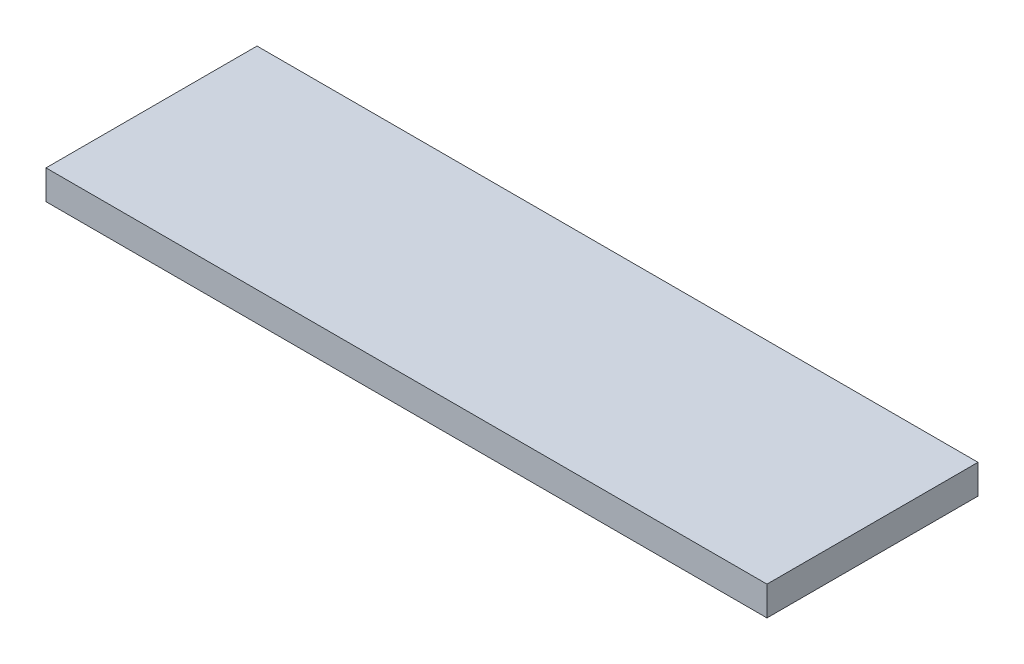
ISO-10303-21;
HEADER;
FILE_DESCRIPTION(('STEP AP214'),'2;1');
FILE_NAME('part.step','',(''),(''),'','','');
FILE_SCHEMA(('AUTOMOTIVE_DESIGN { 1 0 10303 214 1 1 1 1 }'));
ENDSEC;
DATA;
#1=APPLICATION_CONTEXT('core data for automotive mechanical design processes');
#2=APPLICATION_PROTOCOL_DEFINITION('international standard','automotive_design',2000,#1);
#3=PRODUCT_CONTEXT('',#1,'mechanical');
#4=PRODUCT('Part','Part','',(#3));
#5=PRODUCT_RELATED_PRODUCT_CATEGORY('part','',(#4));
#6=PRODUCT_DEFINITION_FORMATION('','',#4);
#7=PRODUCT_DEFINITION_CONTEXT('part definition',#1,'design');
#8=PRODUCT_DEFINITION('design','',#6,#7);
#9=PRODUCT_DEFINITION_SHAPE('','',#8);
#10=(LENGTH_UNIT() NAMED_UNIT(*) SI_UNIT(.MILLI.,.METRE.));
#11=(NAMED_UNIT(*) PLANE_ANGLE_UNIT() SI_UNIT($,.RADIAN.));
#12=(NAMED_UNIT(*) SI_UNIT($,.STERADIAN.) SOLID_ANGLE_UNIT());
#13=UNCERTAINTY_MEASURE_WITH_UNIT(LENGTH_MEASURE(1.E-05),#10,'distance_accuracy_value','');
#14=(GEOMETRIC_REPRESENTATION_CONTEXT(3) GLOBAL_UNCERTAINTY_ASSIGNED_CONTEXT((#13)) GLOBAL_UNIT_ASSIGNED_CONTEXT((#10,
#11,#12)) REPRESENTATION_CONTEXT('',''));
#15=CARTESIAN_POINT('',(0.,0.,0.));
#16=DIRECTION('',(0.,0.,1.));
#17=DIRECTION('',(1.,0.,0.));
#18=AXIS2_PLACEMENT_3D('',#15,#16,#17);
#19=CARTESIAN_POINT('',(0.,10.,0.));
#20=DIRECTION('',(1.,0.,0.));
#21=DIRECTION('',(0.,0.,-1.));
#22=AXIS2_PLACEMENT_3D('',#19,#20,#21);
#23=PLANE('',#22);
#24=DIRECTION('',(0.,0.,1.));
#25=VECTOR('',#24,1.);
#26=CARTESIAN_POINT('',(0.,0.,0.));
#27=LINE('',#26,#25);
#28=CARTESIAN_POINT('',(0.,0.,0.));
#29=VERTEX_POINT('',#28);
#30=CARTESIAN_POINT('',(0.,0.,72.));
#31=VERTEX_POINT('',#30);
#32=EDGE_CURVE('E98',#29,#31,#27,.T.);
#33=ORIENTED_EDGE('',*,*,#32,.T.);
#34=DIRECTION('',(0.,-1.,0.));
#35=VECTOR('',#34,1.);
#36=CARTESIAN_POINT('',(0.,10.,72.));
#37=LINE('',#36,#35);
#38=CARTESIAN_POINT('',(0.,10.,72.));
#39=VERTEX_POINT('',#38);
#40=EDGE_CURVE('E11',#39,#31,#37,.T.);
#41=ORIENTED_EDGE('',*,*,#40,.F.);
#42=DIRECTION('',(0.,0.,1.));
#43=VECTOR('',#42,1.);
#44=CARTESIAN_POINT('',(0.,10.,0.));
#45=LINE('',#44,#43);
#46=CARTESIAN_POINT('',(0.,10.,0.));
#47=VERTEX_POINT('',#46);
#48=EDGE_CURVE('E86',#47,#39,#45,.T.);
#49=ORIENTED_EDGE('',*,*,#48,.F.);
#50=DIRECTION('',(0.,-1.,0.));
#51=VECTOR('',#50,1.);
#52=CARTESIAN_POINT('',(0.,10.,0.));
#53=LINE('',#52,#51);
#54=EDGE_CURVE('E94',#47,#29,#53,.T.);
#55=ORIENTED_EDGE('',*,*,#54,.T.);
#56=EDGE_LOOP('',(#33,#41,#49,#55));
#57=FACE_BOUND('',#56,.T.);
#58=ADVANCED_FACE('F35',(#57),#23,.F.);
#59=CARTESIAN_POINT('',(0.,10.,72.));
#60=DIRECTION('',(0.,0.,-1.));
#61=DIRECTION('',(-1.,0.,0.));
#62=AXIS2_PLACEMENT_3D('',#59,#60,#61);
#63=PLANE('',#62);
#64=DIRECTION('',(1.,0.,0.));
#65=VECTOR('',#64,1.);
#66=CARTESIAN_POINT('',(0.,0.,72.));
#67=LINE('',#66,#65);
#68=CARTESIAN_POINT('',(246.,0.,72.));
#69=VERTEX_POINT('',#68);
#70=EDGE_CURVE('E90',#31,#69,#67,.T.);
#71=ORIENTED_EDGE('',*,*,#70,.T.);
#72=DIRECTION('',(0.,-1.,0.));
#73=VECTOR('',#72,1.);
#74=CARTESIAN_POINT('',(246.,10.,72.));
#75=LINE('',#74,#73);
#76=CARTESIAN_POINT('',(246.,10.,72.));
#77=VERTEX_POINT('',#76);
#78=EDGE_CURVE('E43',#77,#69,#75,.T.);
#79=ORIENTED_EDGE('',*,*,#78,.F.);
#80=DIRECTION('',(1.,0.,0.));
#81=VECTOR('',#80,1.);
#82=CARTESIAN_POINT('',(0.,10.,72.));
#83=LINE('',#82,#81);
#84=EDGE_CURVE('E81',#39,#77,#83,.T.);
#85=ORIENTED_EDGE('',*,*,#84,.F.);
#86=ORIENTED_EDGE('',*,*,#40,.T.);
#87=EDGE_LOOP('',(#71,#79,#85,#86));
#88=FACE_BOUND('',#87,.T.);
#89=ADVANCED_FACE('F89',(#88),#63,.F.);
#90=CARTESIAN_POINT('',(246.,10.,0.));
#91=DIRECTION('',(-1.,0.,0.));
#92=DIRECTION('',(0.,0.,1.));
#93=AXIS2_PLACEMENT_3D('',#90,#91,#92);
#94=PLANE('',#93);
#95=DIRECTION('',(0.,0.,-1.));
#96=VECTOR('',#95,1.);
#97=CARTESIAN_POINT('',(246.,0.,0.));
#98=LINE('',#97,#96);
#99=CARTESIAN_POINT('',(246.,0.,0.));
#100=VERTEX_POINT('',#99);
#101=EDGE_CURVE('E68',#69,#100,#98,.T.);
#102=ORIENTED_EDGE('',*,*,#101,.T.);
#103=DIRECTION('',(0.,-1.,0.));
#104=VECTOR('',#103,1.);
#105=CARTESIAN_POINT('',(246.,10.,0.));
#106=LINE('',#105,#104);
#107=CARTESIAN_POINT('',(246.,10.,0.));
#108=VERTEX_POINT('',#107);
#109=EDGE_CURVE('E91',#108,#100,#106,.T.);
#110=ORIENTED_EDGE('',*,*,#109,.F.);
#111=DIRECTION('',(0.,0.,-1.));
#112=VECTOR('',#111,1.);
#113=CARTESIAN_POINT('',(246.,10.,0.));
#114=LINE('',#113,#112);
#115=EDGE_CURVE('E84',#77,#108,#114,.T.);
#116=ORIENTED_EDGE('',*,*,#115,.F.);
#117=ORIENTED_EDGE('',*,*,#78,.T.);
#118=EDGE_LOOP('',(#102,#110,#116,#117));
#119=FACE_BOUND('',#118,.T.);
#120=ADVANCED_FACE('F92',(#119),#94,.F.);
#121=CARTESIAN_POINT('',(0.,10.,0.));
#122=DIRECTION('',(0.,0.,1.));
#123=DIRECTION('',(1.,0.,0.));
#124=AXIS2_PLACEMENT_3D('',#121,#122,#123);
#125=PLANE('',#124);
#126=DIRECTION('',(-1.,0.,0.));
#127=VECTOR('',#126,1.);
#128=CARTESIAN_POINT('',(0.,0.,0.));
#129=LINE('',#128,#127);
#130=EDGE_CURVE('E74',#100,#29,#129,.T.);
#131=ORIENTED_EDGE('',*,*,#130,.T.);
#132=ORIENTED_EDGE('',*,*,#54,.F.);
#133=DIRECTION('',(-1.,0.,0.));
#134=VECTOR('',#133,1.);
#135=CARTESIAN_POINT('',(0.,10.,0.));
#136=LINE('',#135,#134);
#137=EDGE_CURVE('E51',#108,#47,#136,.T.);
#138=ORIENTED_EDGE('',*,*,#137,.F.);
#139=ORIENTED_EDGE('',*,*,#109,.T.);
#140=EDGE_LOOP('',(#131,#132,#138,#139));
#141=FACE_BOUND('',#140,.T.);
#142=ADVANCED_FACE('F105',(#141),#125,.F.);
#143=CARTESIAN_POINT('',(0.,10.,0.));
#144=DIRECTION('',(0.,1.,0.));
#145=DIRECTION('',(0.,0.,1.));
#146=AXIS2_PLACEMENT_3D('',#143,#144,#145);
#147=PLANE('',#146);
#148=ORIENTED_EDGE('',*,*,#48,.T.);
#149=ORIENTED_EDGE('',*,*,#84,.T.);
#150=ORIENTED_EDGE('',*,*,#115,.T.);
#151=ORIENTED_EDGE('',*,*,#137,.T.);
#152=EDGE_LOOP('',(#148,#149,#150,#151));
#153=FACE_BOUND('',#152,.T.);
#154=ADVANCED_FACE('F82',(#153),#147,.T.);
#155=CARTESIAN_POINT('',(0.,0.,0.));
#156=DIRECTION('',(0.,1.,0.));
#157=DIRECTION('',(0.,0.,1.));
#158=AXIS2_PLACEMENT_3D('',#155,#156,#157);
#159=PLANE('',#158);
#160=ORIENTED_EDGE('',*,*,#32,.F.);
#161=ORIENTED_EDGE('',*,*,#130,.F.);
#162=ORIENTED_EDGE('',*,*,#101,.F.);
#163=ORIENTED_EDGE('',*,*,#70,.F.);
#164=EDGE_LOOP('',(#160,#161,#162,#163));
#165=FACE_BOUND('',#164,.T.);
#166=ADVANCED_FACE('F108',(#165),#159,.F.);
#167=CLOSED_SHELL('',(#58,#89,#120,#142,#154,#166));
#168=MANIFOLD_SOLID_BREP('B2',#167);
#169=ADVANCED_BREP_SHAPE_REPRESENTATION('',(#18,#168),#14);
#170=SHAPE_DEFINITION_REPRESENTATION(#9,#169);
ENDSEC;
END-ISO-10303-21;
